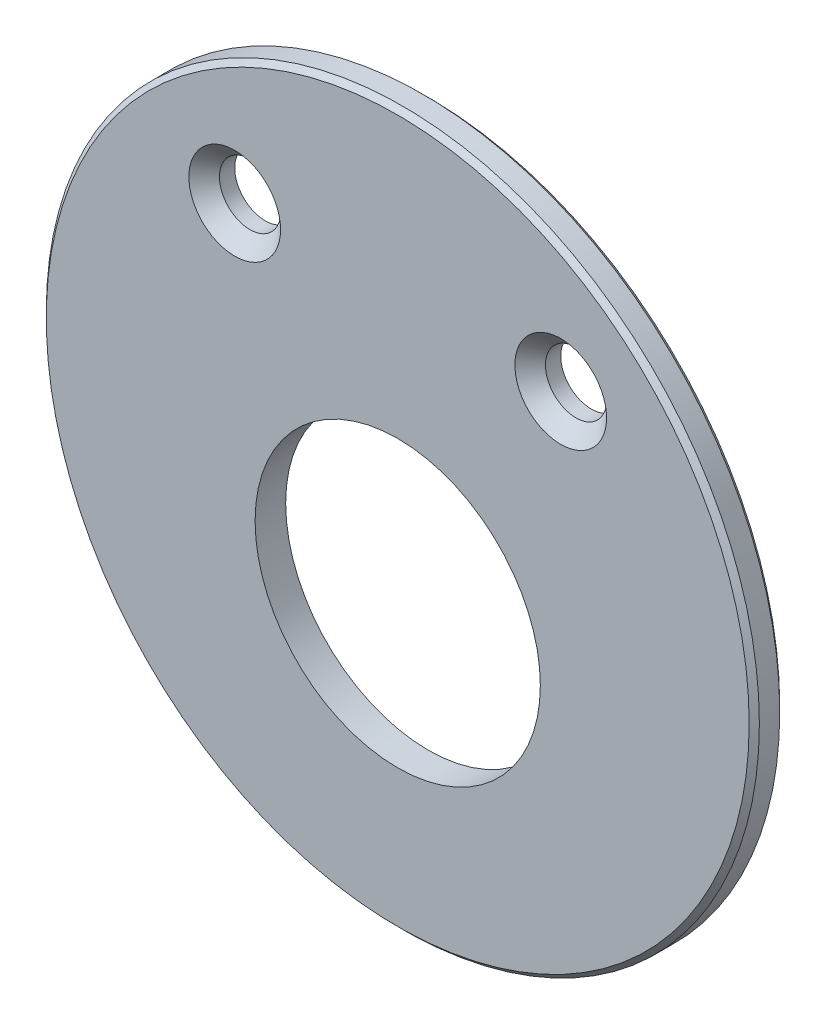
ISO-10303-21;
HEADER;
FILE_DESCRIPTION(('STEP AP214'),'2;1');
FILE_NAME('part.step','',(''),(''),'','','');
FILE_SCHEMA(('AUTOMOTIVE_DESIGN { 1 0 10303 214 1 1 1 1 }'));
ENDSEC;
DATA;
#1=APPLICATION_CONTEXT('core data for automotive mechanical design processes');
#2=APPLICATION_PROTOCOL_DEFINITION('international standard','automotive_design',2000,#1);
#3=PRODUCT_CONTEXT('',#1,'mechanical');
#4=PRODUCT('Part','Part','',(#3));
#5=PRODUCT_RELATED_PRODUCT_CATEGORY('part','',(#4));
#6=PRODUCT_DEFINITION_FORMATION('','',#4);
#7=PRODUCT_DEFINITION_CONTEXT('part definition',#1,'design');
#8=PRODUCT_DEFINITION('design','',#6,#7);
#9=PRODUCT_DEFINITION_SHAPE('','',#8);
#10=(LENGTH_UNIT() NAMED_UNIT(*) SI_UNIT(.MILLI.,.METRE.));
#11=(NAMED_UNIT(*) PLANE_ANGLE_UNIT() SI_UNIT($,.RADIAN.));
#12=(NAMED_UNIT(*) SI_UNIT($,.STERADIAN.) SOLID_ANGLE_UNIT());
#13=UNCERTAINTY_MEASURE_WITH_UNIT(LENGTH_MEASURE(1.E-05),#10,'distance_accuracy_value','');
#14=(GEOMETRIC_REPRESENTATION_CONTEXT(3) GLOBAL_UNCERTAINTY_ASSIGNED_CONTEXT((#13)) GLOBAL_UNIT_ASSIGNED_CONTEXT((#10,
#11,#12)) REPRESENTATION_CONTEXT('',''));
#15=CARTESIAN_POINT('',(0.,0.,0.));
#16=DIRECTION('',(0.,0.,1.));
#17=DIRECTION('',(1.,0.,0.));
#18=AXIS2_PLACEMENT_3D('',#15,#16,#17);
#19=CARTESIAN_POINT('',(0.,0.,1.5));
#20=DIRECTION('',(0.,0.,-1.));
#21=DIRECTION('',(-1.,0.,0.));
#22=AXIS2_PLACEMENT_3D('',#19,#20,#21);
#23=CYLINDRICAL_SURFACE('',#22,17.5);
#24=CARTESIAN_POINT('',(0.,0.,0.249999999999997));
#25=DIRECTION('',(0.,0.,1.));
#26=DIRECTION('',(1.,0.,0.));
#27=AXIS2_PLACEMENT_3D('',#24,#25,#26);
#28=CIRCLE('',#27,17.5);
#29=CARTESIAN_POINT('',(17.5,0.,0.249999999999997));
#30=VERTEX_POINT('',#29);
#31=EDGE_CURVE('E57',#30,#30,#28,.T.);
#32=ORIENTED_EDGE('',*,*,#31,.T.);
#33=EDGE_LOOP('',(#32));
#34=FACE_BOUND('',#33,.T.);
#35=CARTESIAN_POINT('',(0.,0.,1.25));
#36=DIRECTION('',(0.,0.,1.));
#37=DIRECTION('',(1.,0.,0.));
#38=AXIS2_PLACEMENT_3D('',#35,#36,#37);
#39=CIRCLE('',#38,17.5);
#40=CARTESIAN_POINT('',(17.5,0.,1.25));
#41=VERTEX_POINT('',#40);
#42=EDGE_CURVE('E62',#41,#41,#39,.F.);
#43=ORIENTED_EDGE('',*,*,#42,.T.);
#44=EDGE_LOOP('',(#43));
#45=FACE_BOUND('',#44,.T.);
#46=ADVANCED_FACE('F43',(#34,#45),#23,.T.);
#47=CARTESIAN_POINT('',(0.,0.,1.5));
#48=DIRECTION('',(0.,0.,1.));
#49=DIRECTION('',(1.,0.,0.));
#50=AXIS2_PLACEMENT_3D('',#47,#48,#49);
#51=PLANE('',#50);
#52=CARTESIAN_POINT('',(0.,0.,1.5));
#53=DIRECTION('',(0.,0.,1.));
#54=DIRECTION('',(1.,0.,0.));
#55=AXIS2_PLACEMENT_3D('',#52,#53,#54);
#56=CIRCLE('',#55,17.25);
#57=CARTESIAN_POINT('',(17.25,0.,1.5));
#58=VERTEX_POINT('',#57);
#59=EDGE_CURVE('E10',#58,#58,#56,.T.);
#60=ORIENTED_EDGE('',*,*,#59,.T.);
#61=EDGE_LOOP('',(#60));
#62=FACE_BOUND('',#61,.T.);
#63=CARTESIAN_POINT('',(8.,9.5,1.5));
#64=DIRECTION('',(0.,0.,1.));
#65=DIRECTION('',(1.,0.,0.));
#66=AXIS2_PLACEMENT_3D('',#63,#64,#65);
#67=CIRCLE('',#66,2.25);
#68=CARTESIAN_POINT('',(10.25,9.5,1.5));
#69=VERTEX_POINT('',#68);
#70=EDGE_CURVE('E72',#69,#69,#67,.F.);
#71=ORIENTED_EDGE('',*,*,#70,.T.);
#72=EDGE_LOOP('',(#71));
#73=FACE_BOUND('',#72,.T.);
#74=CARTESIAN_POINT('',(-8.,9.5,1.5));
#75=DIRECTION('',(0.,0.,1.));
#76=DIRECTION('',(1.,0.,0.));
#77=AXIS2_PLACEMENT_3D('',#74,#75,#76);
#78=CIRCLE('',#77,2.25);
#79=CARTESIAN_POINT('',(-5.75,9.5,1.5));
#80=VERTEX_POINT('',#79);
#81=EDGE_CURVE('E76',#80,#80,#78,.F.);
#82=ORIENTED_EDGE('',*,*,#81,.T.);
#83=EDGE_LOOP('',(#82));
#84=FACE_BOUND('',#83,.T.);
#85=CARTESIAN_POINT('',(0.,-3.5,1.5));
#86=DIRECTION('',(0.,0.,1.));
#87=DIRECTION('',(1.,0.,0.));
#88=AXIS2_PLACEMENT_3D('',#85,#86,#87);
#89=CIRCLE('',#88,7.);
#90=CARTESIAN_POINT('',(7.,-3.5,1.5));
#91=VERTEX_POINT('',#90);
#92=EDGE_CURVE('E93',#91,#91,#89,.T.);
#93=ORIENTED_EDGE('',*,*,#92,.F.);
#94=EDGE_LOOP('',(#93));
#95=FACE_BOUND('',#94,.T.);
#96=ADVANCED_FACE('F112',(#62,#73,#84,#95),#51,.T.);
#97=CARTESIAN_POINT('',(0.,0.,0.));
#98=DIRECTION('',(0.,0.,1.));
#99=DIRECTION('',(1.,0.,0.));
#100=AXIS2_PLACEMENT_3D('',#97,#98,#99);
#101=PLANE('',#100);
#102=CARTESIAN_POINT('',(0.,0.,0.));
#103=DIRECTION('',(0.,0.,1.));
#104=DIRECTION('',(1.,0.,0.));
#105=AXIS2_PLACEMENT_3D('',#102,#103,#104);
#106=CIRCLE('',#105,17.25);
#107=CARTESIAN_POINT('',(17.25,0.,0.));
#108=VERTEX_POINT('',#107);
#109=EDGE_CURVE('E52',#108,#108,#106,.F.);
#110=ORIENTED_EDGE('',*,*,#109,.T.);
#111=EDGE_LOOP('',(#110));
#112=FACE_BOUND('',#111,.T.);
#113=CARTESIAN_POINT('',(0.,-3.5,0.));
#114=DIRECTION('',(0.,0.,1.));
#115=DIRECTION('',(1.,0.,0.));
#116=AXIS2_PLACEMENT_3D('',#113,#114,#115);
#117=CIRCLE('',#116,7.);
#118=CARTESIAN_POINT('',(7.,-3.5,0.));
#119=VERTEX_POINT('',#118);
#120=EDGE_CURVE('E84',#119,#119,#117,.T.);
#121=ORIENTED_EDGE('',*,*,#120,.T.);
#122=EDGE_LOOP('',(#121));
#123=FACE_BOUND('',#122,.T.);
#124=CARTESIAN_POINT('',(-8.,9.5,0.));
#125=DIRECTION('',(0.,0.,1.));
#126=DIRECTION('',(1.,0.,0.));
#127=AXIS2_PLACEMENT_3D('',#124,#125,#126);
#128=CIRCLE('',#127,1.5);
#129=CARTESIAN_POINT('',(-6.5,9.5,0.));
#130=VERTEX_POINT('',#129);
#131=EDGE_CURVE('E89',#130,#130,#128,.T.);
#132=ORIENTED_EDGE('',*,*,#131,.T.);
#133=EDGE_LOOP('',(#132));
#134=FACE_BOUND('',#133,.T.);
#135=CARTESIAN_POINT('',(8.,9.5,0.));
#136=DIRECTION('',(0.,0.,1.));
#137=DIRECTION('',(1.,0.,0.));
#138=AXIS2_PLACEMENT_3D('',#135,#136,#137);
#139=CIRCLE('',#138,1.5);
#140=CARTESIAN_POINT('',(9.5,9.5,0.));
#141=VERTEX_POINT('',#140);
#142=EDGE_CURVE('E85',#141,#141,#139,.T.);
#143=ORIENTED_EDGE('',*,*,#142,.T.);
#144=EDGE_LOOP('',(#143));
#145=FACE_BOUND('',#144,.T.);
#146=ADVANCED_FACE('F101',(#112,#123,#134,#145),#101,.F.);
#147=CARTESIAN_POINT('',(8.,9.5,0.));
#148=DIRECTION('',(0.,0.,1.));
#149=DIRECTION('',(1.,0.,0.));
#150=AXIS2_PLACEMENT_3D('',#147,#148,#149);
#151=CYLINDRICAL_SURFACE('',#150,1.5);
#152=CARTESIAN_POINT('',(8.,9.5,0.749999999999992));
#153=DIRECTION('',(0.,0.,1.));
#154=DIRECTION('',(1.,0.,0.));
#155=AXIS2_PLACEMENT_3D('',#152,#153,#154);
#156=CIRCLE('',#155,1.5);
#157=CARTESIAN_POINT('',(9.5,9.5,0.749999999999992));
#158=VERTEX_POINT('',#157);
#159=EDGE_CURVE('E80',#158,#158,#156,.T.);
#160=ORIENTED_EDGE('',*,*,#159,.T.);
#161=EDGE_LOOP('',(#160));
#162=FACE_BOUND('',#161,.T.);
#163=ORIENTED_EDGE('',*,*,#142,.F.);
#164=EDGE_LOOP('',(#163));
#165=FACE_BOUND('',#164,.T.);
#166=ADVANCED_FACE('F119',(#162,#165),#151,.F.);
#167=CARTESIAN_POINT('',(-8.,9.5,0.));
#168=DIRECTION('',(0.,0.,1.));
#169=DIRECTION('',(1.,0.,0.));
#170=AXIS2_PLACEMENT_3D('',#167,#168,#169);
#171=CYLINDRICAL_SURFACE('',#170,1.5);
#172=CARTESIAN_POINT('',(-8.,9.5,0.749999999999992));
#173=DIRECTION('',(0.,0.,1.));
#174=DIRECTION('',(1.,0.,0.));
#175=AXIS2_PLACEMENT_3D('',#172,#173,#174);
#176=CIRCLE('',#175,1.5);
#177=CARTESIAN_POINT('',(-6.5,9.5,0.749999999999992));
#178=VERTEX_POINT('',#177);
#179=EDGE_CURVE('E68',#178,#178,#176,.T.);
#180=ORIENTED_EDGE('',*,*,#179,.T.);
#181=EDGE_LOOP('',(#180));
#182=FACE_BOUND('',#181,.T.);
#183=ORIENTED_EDGE('',*,*,#131,.F.);
#184=EDGE_LOOP('',(#183));
#185=FACE_BOUND('',#184,.T.);
#186=ADVANCED_FACE('F108',(#182,#185),#171,.F.);
#187=CARTESIAN_POINT('',(0.,-3.5,0.));
#188=DIRECTION('',(0.,0.,1.));
#189=DIRECTION('',(1.,0.,0.));
#190=AXIS2_PLACEMENT_3D('',#187,#188,#189);
#191=CYLINDRICAL_SURFACE('',#190,7.);
#192=ORIENTED_EDGE('',*,*,#120,.F.);
#193=EDGE_LOOP('',(#192));
#194=FACE_BOUND('',#193,.T.);
#195=ORIENTED_EDGE('',*,*,#92,.T.);
#196=EDGE_LOOP('',(#195));
#197=FACE_BOUND('',#196,.T.);
#198=ADVANCED_FACE('F104',(#194,#197),#191,.F.);
#199=CARTESIAN_POINT('',(8.,9.5,0.749999999999992));
#200=DIRECTION('',(0.,0.,1.));
#201=DIRECTION('',(1.,0.,0.));
#202=AXIS2_PLACEMENT_3D('',#199,#200,#201);
#203=CONICAL_SURFACE('',#202,1.5,0.785398163397445);
#204=ORIENTED_EDGE('',*,*,#70,.F.);
#205=EDGE_LOOP('',(#204));
#206=FACE_BOUND('',#205,.T.);
#207=ORIENTED_EDGE('',*,*,#159,.F.);
#208=EDGE_LOOP('',(#207));
#209=FACE_BOUND('',#208,.T.);
#210=ADVANCED_FACE('F107',(#206,#209),#203,.F.);
#211=CARTESIAN_POINT('',(-8.,9.5,0.749999999999992));
#212=DIRECTION('',(0.,0.,1.));
#213=DIRECTION('',(1.,0.,0.));
#214=AXIS2_PLACEMENT_3D('',#211,#212,#213);
#215=CONICAL_SURFACE('',#214,1.5,0.785398163397445);
#216=ORIENTED_EDGE('',*,*,#81,.F.);
#217=EDGE_LOOP('',(#216));
#218=FACE_BOUND('',#217,.T.);
#219=ORIENTED_EDGE('',*,*,#179,.F.);
#220=EDGE_LOOP('',(#219));
#221=FACE_BOUND('',#220,.T.);
#222=ADVANCED_FACE('F133',(#218,#221),#215,.F.);
#223=CARTESIAN_POINT('',(0.,0.,0.249999999999997));
#224=DIRECTION('',(0.,0.,1.));
#225=DIRECTION('',(1.,0.,0.));
#226=AXIS2_PLACEMENT_3D('',#223,#224,#225);
#227=CONICAL_SURFACE('',#226,17.5,0.785398163397448);
#228=ORIENTED_EDGE('',*,*,#109,.F.);
#229=EDGE_LOOP('',(#228));
#230=FACE_BOUND('',#229,.T.);
#231=ORIENTED_EDGE('',*,*,#31,.F.);
#232=EDGE_LOOP('',(#231));
#233=FACE_BOUND('',#232,.T.);
#234=ADVANCED_FACE('F139',(#230,#233),#227,.T.);
#235=CARTESIAN_POINT('',(0.,0.,1.5));
#236=DIRECTION('',(0.,0.,-1.));
#237=DIRECTION('',(-1.,0.,0.));
#238=AXIS2_PLACEMENT_3D('',#235,#236,#237);
#239=CONICAL_SURFACE('',#238,17.25,0.785398163397441);
#240=ORIENTED_EDGE('',*,*,#42,.F.);
#241=EDGE_LOOP('',(#240));
#242=FACE_BOUND('',#241,.T.);
#243=ORIENTED_EDGE('',*,*,#59,.F.);
#244=EDGE_LOOP('',(#243));
#245=FACE_BOUND('',#244,.T.);
#246=ADVANCED_FACE('F46',(#242,#245),#239,.T.);
#247=CLOSED_SHELL('',(#46,#96,#146,#166,#186,#198,#210,#222,#234,#246));
#248=MANIFOLD_SOLID_BREP('B2',#247);
#249=ADVANCED_BREP_SHAPE_REPRESENTATION('',(#18,#248),#14);
#250=SHAPE_DEFINITION_REPRESENTATION(#9,#249);
ENDSEC;
END-ISO-10303-21;
